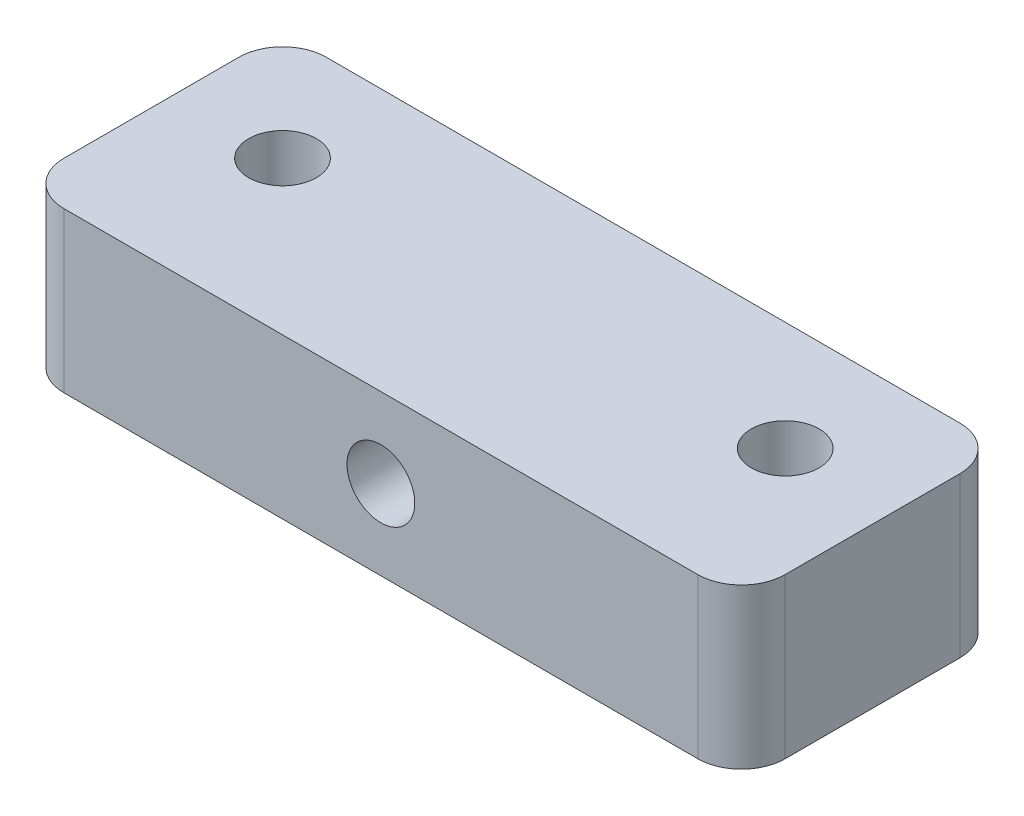
ISO-10303-21;
HEADER;
FILE_DESCRIPTION(('STEP AP214'),'2;1');
FILE_NAME('part.step','',(''),(''),'','','');
FILE_SCHEMA(('AUTOMOTIVE_DESIGN { 1 0 10303 214 1 1 1 1 }'));
ENDSEC;
DATA;
#1=APPLICATION_CONTEXT('core data for automotive mechanical design processes');
#2=APPLICATION_PROTOCOL_DEFINITION('international standard','automotive_design',2000,#1);
#3=PRODUCT_CONTEXT('',#1,'mechanical');
#4=PRODUCT('Part','Part','',(#3));
#5=PRODUCT_RELATED_PRODUCT_CATEGORY('part','',(#4));
#6=PRODUCT_DEFINITION_FORMATION('','',#4);
#7=PRODUCT_DEFINITION_CONTEXT('part definition',#1,'design');
#8=PRODUCT_DEFINITION('design','',#6,#7);
#9=PRODUCT_DEFINITION_SHAPE('','',#8);
#10=(LENGTH_UNIT() NAMED_UNIT(*) SI_UNIT(.MILLI.,.METRE.));
#11=(NAMED_UNIT(*) PLANE_ANGLE_UNIT() SI_UNIT($,.RADIAN.));
#12=(NAMED_UNIT(*) SI_UNIT($,.STERADIAN.) SOLID_ANGLE_UNIT());
#13=UNCERTAINTY_MEASURE_WITH_UNIT(LENGTH_MEASURE(1.E-05),#10,'distance_accuracy_value','');
#14=(GEOMETRIC_REPRESENTATION_CONTEXT(3) GLOBAL_UNCERTAINTY_ASSIGNED_CONTEXT((#13)) GLOBAL_UNIT_ASSIGNED_CONTEXT((#10,
#11,#12)) REPRESENTATION_CONTEXT('',''));
#15=CARTESIAN_POINT('',(0.,0.,0.));
#16=DIRECTION('',(0.,0.,1.));
#17=DIRECTION('',(1.,0.,0.));
#18=AXIS2_PLACEMENT_3D('',#15,#16,#17);
#19=CARTESIAN_POINT('',(0.,3.65,0.));
#20=DIRECTION('',(0.,1.,0.));
#21=DIRECTION('',(0.,0.,1.));
#22=AXIS2_PLACEMENT_3D('',#19,#20,#21);
#23=PLANE('',#22);
#24=CARTESIAN_POINT('',(-11.5,3.65,-7.));
#25=DIRECTION('',(0.,1.,0.));
#26=DIRECTION('',(0.,0.,1.));
#27=AXIS2_PLACEMENT_3D('',#24,#25,#26);
#28=CIRCLE('',#27,1.55);
#29=CARTESIAN_POINT('',(-11.5,3.65,-5.45));
#30=VERTEX_POINT('',#29);
#31=EDGE_CURVE('E125',#30,#30,#28,.T.);
#32=ORIENTED_EDGE('',*,*,#31,.F.);
#33=EDGE_LOOP('',(#32));
#34=FACE_BOUND('',#33,.T.);
#35=DIRECTION('',(-1.,0.,0.));
#36=VECTOR('',#35,1.);
#37=CARTESIAN_POINT('',(-16.5,3.65,-12.));
#38=LINE('',#37,#36);
#39=CARTESIAN_POINT('',(14.5,3.65,-12.));
#40=VERTEX_POINT('',#39);
#41=CARTESIAN_POINT('',(-14.5,3.65,-12.));
#42=VERTEX_POINT('',#41);
#43=EDGE_CURVE('E134',#40,#42,#38,.T.);
#44=ORIENTED_EDGE('',*,*,#43,.T.);
#45=CARTESIAN_POINT('',(-14.5,3.65,-10.));
#46=DIRECTION('',(0.,1.,0.));
#47=DIRECTION('',(0.,0.,1.));
#48=AXIS2_PLACEMENT_3D('',#45,#46,#47);
#49=CIRCLE('',#48,2.);
#50=CARTESIAN_POINT('',(-16.5,3.65,-10.));
#51=VERTEX_POINT('',#50);
#52=EDGE_CURVE('E161',#42,#51,#49,.T.);
#53=ORIENTED_EDGE('',*,*,#52,.T.);
#54=DIRECTION('',(0.,0.,1.));
#55=VECTOR('',#54,1.);
#56=CARTESIAN_POINT('',(-16.5,3.65,-12.));
#57=LINE('',#56,#55);
#58=CARTESIAN_POINT('',(-16.5,3.65,-2.));
#59=VERTEX_POINT('',#58);
#60=EDGE_CURVE('E118',#51,#59,#57,.T.);
#61=ORIENTED_EDGE('',*,*,#60,.T.);
#62=CARTESIAN_POINT('',(-14.5,3.65,-2.));
#63=DIRECTION('',(0.,1.,0.));
#64=DIRECTION('',(0.,0.,1.));
#65=AXIS2_PLACEMENT_3D('',#62,#63,#64);
#66=CIRCLE('',#65,2.);
#67=CARTESIAN_POINT('',(-14.5,3.65,0.));
#68=VERTEX_POINT('',#67);
#69=EDGE_CURVE('E156',#59,#68,#66,.T.);
#70=ORIENTED_EDGE('',*,*,#69,.T.);
#71=DIRECTION('',(1.,0.,0.));
#72=VECTOR('',#71,1.);
#73=CARTESIAN_POINT('',(-16.5,3.65,0.));
#74=LINE('',#73,#72);
#75=CARTESIAN_POINT('',(14.5,3.65,0.));
#76=VERTEX_POINT('',#75);
#77=EDGE_CURVE('E172',#68,#76,#74,.T.);
#78=ORIENTED_EDGE('',*,*,#77,.T.);
#79=CARTESIAN_POINT('',(14.5,3.65,-2.));
#80=DIRECTION('',(0.,1.,0.));
#81=DIRECTION('',(0.,0.,1.));
#82=AXIS2_PLACEMENT_3D('',#79,#80,#81);
#83=CIRCLE('',#82,2.);
#84=CARTESIAN_POINT('',(16.5,3.65,-2.));
#85=VERTEX_POINT('',#84);
#86=EDGE_CURVE('E54',#76,#85,#83,.T.);
#87=ORIENTED_EDGE('',*,*,#86,.T.);
#88=DIRECTION('',(0.,0.,-1.));
#89=VECTOR('',#88,1.);
#90=CARTESIAN_POINT('',(16.5,3.65,-12.));
#91=LINE('',#90,#89);
#92=CARTESIAN_POINT('',(16.5,3.65,-10.));
#93=VERTEX_POINT('',#92);
#94=EDGE_CURVE('E180',#85,#93,#91,.T.);
#95=ORIENTED_EDGE('',*,*,#94,.T.);
#96=CARTESIAN_POINT('',(14.5,3.65,-10.));
#97=DIRECTION('',(0.,1.,0.));
#98=DIRECTION('',(0.,0.,1.));
#99=AXIS2_PLACEMENT_3D('',#96,#97,#98);
#100=CIRCLE('',#99,2.);
#101=EDGE_CURVE('E159',#93,#40,#100,.T.);
#102=ORIENTED_EDGE('',*,*,#101,.T.);
#103=EDGE_LOOP('',(#44,#53,#61,#70,#78,#87,#95,#102));
#104=FACE_BOUND('',#103,.T.);
#105=CARTESIAN_POINT('',(11.5,3.65,-7.));
#106=DIRECTION('',(0.,1.,0.));
#107=DIRECTION('',(0.,0.,-1.));
#108=AXIS2_PLACEMENT_3D('',#105,#106,#107);
#109=CIRCLE('',#108,1.55);
#110=CARTESIAN_POINT('',(11.5,3.65,-8.55));
#111=VERTEX_POINT('',#110);
#112=EDGE_CURVE('E131',#111,#111,#109,.T.);
#113=ORIENTED_EDGE('',*,*,#112,.F.);
#114=EDGE_LOOP('',(#113));
#115=FACE_BOUND('',#114,.T.);
#116=ADVANCED_FACE('F32',(#34,#104,#115),#23,.T.);
#117=CARTESIAN_POINT('',(0.,-3.65,0.));
#118=DIRECTION('',(0.,1.,0.));
#119=DIRECTION('',(0.,0.,1.));
#120=AXIS2_PLACEMENT_3D('',#117,#118,#119);
#121=PLANE('',#120);
#122=CARTESIAN_POINT('',(-11.5,-3.65,-7.));
#123=DIRECTION('',(0.,1.,0.));
#124=DIRECTION('',(0.,0.,1.));
#125=AXIS2_PLACEMENT_3D('',#122,#123,#124);
#126=CIRCLE('',#125,1.9);
#127=CARTESIAN_POINT('',(-11.5,-3.65,-5.1));
#128=VERTEX_POINT('',#127);
#129=EDGE_CURVE('E144',#128,#128,#126,.T.);
#130=ORIENTED_EDGE('',*,*,#129,.T.);
#131=EDGE_LOOP('',(#130));
#132=FACE_BOUND('',#131,.T.);
#133=CARTESIAN_POINT('',(11.5,-3.65,-7.));
#134=DIRECTION('',(0.,1.,0.));
#135=DIRECTION('',(0.,0.,1.));
#136=AXIS2_PLACEMENT_3D('',#133,#134,#135);
#137=CIRCLE('',#136,1.9);
#138=CARTESIAN_POINT('',(11.5,-3.65,-5.1));
#139=VERTEX_POINT('',#138);
#140=EDGE_CURVE('E205',#139,#139,#137,.T.);
#141=ORIENTED_EDGE('',*,*,#140,.T.);
#142=EDGE_LOOP('',(#141));
#143=FACE_BOUND('',#142,.T.);
#144=DIRECTION('',(0.,0.,1.));
#145=VECTOR('',#144,1.);
#146=CARTESIAN_POINT('',(-16.5,-3.65,-12.));
#147=LINE('',#146,#145);
#148=CARTESIAN_POINT('',(-16.5,-3.65,-10.));
#149=VERTEX_POINT('',#148);
#150=CARTESIAN_POINT('',(-16.5,-3.65,-2.));
#151=VERTEX_POINT('',#150);
#152=EDGE_CURVE('E115',#149,#151,#147,.T.);
#153=ORIENTED_EDGE('',*,*,#152,.F.);
#154=CARTESIAN_POINT('',(-14.5,-3.65,-10.));
#155=DIRECTION('',(0.,1.,0.));
#156=DIRECTION('',(0.,0.,1.));
#157=AXIS2_PLACEMENT_3D('',#154,#155,#156);
#158=CIRCLE('',#157,2.);
#159=CARTESIAN_POINT('',(-14.5,-3.65,-12.));
#160=VERTEX_POINT('',#159);
#161=EDGE_CURVE('E98',#149,#160,#158,.F.);
#162=ORIENTED_EDGE('',*,*,#161,.T.);
#163=DIRECTION('',(-1.,0.,0.));
#164=VECTOR('',#163,1.);
#165=CARTESIAN_POINT('',(-16.5,-3.65,-12.));
#166=LINE('',#165,#164);
#167=CARTESIAN_POINT('',(14.5,-3.65,-12.));
#168=VERTEX_POINT('',#167);
#169=EDGE_CURVE('E138',#168,#160,#166,.T.);
#170=ORIENTED_EDGE('',*,*,#169,.F.);
#171=CARTESIAN_POINT('',(14.5,-3.65,-10.));
#172=DIRECTION('',(0.,1.,0.));
#173=DIRECTION('',(0.,0.,1.));
#174=AXIS2_PLACEMENT_3D('',#171,#172,#173);
#175=CIRCLE('',#174,2.);
#176=CARTESIAN_POINT('',(16.5,-3.65,-10.));
#177=VERTEX_POINT('',#176);
#178=EDGE_CURVE('E109',#168,#177,#175,.F.);
#179=ORIENTED_EDGE('',*,*,#178,.T.);
#180=DIRECTION('',(0.,0.,-1.));
#181=VECTOR('',#180,1.);
#182=CARTESIAN_POINT('',(16.5,-3.65,-12.));
#183=LINE('',#182,#181);
#184=CARTESIAN_POINT('',(16.5,-3.65,-2.));
#185=VERTEX_POINT('',#184);
#186=EDGE_CURVE('E128',#185,#177,#183,.T.);
#187=ORIENTED_EDGE('',*,*,#186,.F.);
#188=CARTESIAN_POINT('',(14.5,-3.65,-2.));
#189=DIRECTION('',(0.,1.,0.));
#190=DIRECTION('',(0.,0.,1.));
#191=AXIS2_PLACEMENT_3D('',#188,#189,#190);
#192=CIRCLE('',#191,2.);
#193=CARTESIAN_POINT('',(14.5,-3.65,0.));
#194=VERTEX_POINT('',#193);
#195=EDGE_CURVE('E150',#185,#194,#192,.F.);
#196=ORIENTED_EDGE('',*,*,#195,.T.);
#197=DIRECTION('',(1.,0.,0.));
#198=VECTOR('',#197,1.);
#199=CARTESIAN_POINT('',(-16.5,-3.65,0.));
#200=LINE('',#199,#198);
#201=CARTESIAN_POINT('',(-14.5,-3.65,0.));
#202=VERTEX_POINT('',#201);
#203=EDGE_CURVE('E124',#202,#194,#200,.T.);
#204=ORIENTED_EDGE('',*,*,#203,.F.);
#205=CARTESIAN_POINT('',(-14.5,-3.65,-2.));
#206=DIRECTION('',(0.,1.,0.));
#207=DIRECTION('',(0.,0.,1.));
#208=AXIS2_PLACEMENT_3D('',#205,#206,#207);
#209=CIRCLE('',#208,2.);
#210=EDGE_CURVE('E119',#202,#151,#209,.F.);
#211=ORIENTED_EDGE('',*,*,#210,.T.);
#212=EDGE_LOOP('',(#153,#162,#170,#179,#187,#196,#204,#211));
#213=FACE_BOUND('',#212,.T.);
#214=ADVANCED_FACE('F122',(#132,#143,#213),#121,.F.);
#215=CARTESIAN_POINT('',(-16.5,3.65,-12.));
#216=DIRECTION('',(1.,0.,0.));
#217=DIRECTION('',(0.,0.,-1.));
#218=AXIS2_PLACEMENT_3D('',#215,#216,#217);
#219=PLANE('',#218);
#220=ORIENTED_EDGE('',*,*,#60,.F.);
#221=DIRECTION('',(0.,-1.,0.));
#222=VECTOR('',#221,1.);
#223=CARTESIAN_POINT('',(-16.5,3.65,-10.));
#224=LINE('',#223,#222);
#225=EDGE_CURVE('E102',#51,#149,#224,.T.);
#226=ORIENTED_EDGE('',*,*,#225,.T.);
#227=ORIENTED_EDGE('',*,*,#152,.T.);
#228=DIRECTION('',(0.,-1.,0.));
#229=VECTOR('',#228,1.);
#230=CARTESIAN_POINT('',(-16.5,3.65,-2.));
#231=LINE('',#230,#229);
#232=EDGE_CURVE('E120',#151,#59,#231,.F.);
#233=ORIENTED_EDGE('',*,*,#232,.T.);
#234=EDGE_LOOP('',(#220,#226,#227,#233));
#235=FACE_BOUND('',#234,.T.);
#236=ADVANCED_FACE('F114',(#235),#219,.F.);
#237=CARTESIAN_POINT('',(-16.5,3.65,0.));
#238=DIRECTION('',(0.,0.,-1.));
#239=DIRECTION('',(-1.,0.,0.));
#240=AXIS2_PLACEMENT_3D('',#237,#238,#239);
#241=PLANE('',#240);
#242=CARTESIAN_POINT('',(0.,0.,0.));
#243=DIRECTION('',(0.,0.,1.));
#244=DIRECTION('',(1.,0.,0.));
#245=AXIS2_PLACEMENT_3D('',#242,#243,#244);
#246=CIRCLE('',#245,1.55);
#247=CARTESIAN_POINT('',(1.55,0.,0.));
#248=VERTEX_POINT('',#247);
#249=EDGE_CURVE('E147',#248,#248,#246,.T.);
#250=ORIENTED_EDGE('',*,*,#249,.F.);
#251=EDGE_LOOP('',(#250));
#252=FACE_BOUND('',#251,.T.);
#253=ORIENTED_EDGE('',*,*,#203,.T.);
#254=DIRECTION('',(0.,-1.,0.));
#255=VECTOR('',#254,1.);
#256=CARTESIAN_POINT('',(14.5,3.65,0.));
#257=LINE('',#256,#255);
#258=EDGE_CURVE('E11',#194,#76,#257,.F.);
#259=ORIENTED_EDGE('',*,*,#258,.T.);
#260=ORIENTED_EDGE('',*,*,#77,.F.);
#261=DIRECTION('',(0.,-1.,0.));
#262=VECTOR('',#261,1.);
#263=CARTESIAN_POINT('',(-14.5,3.65,0.));
#264=LINE('',#263,#262);
#265=EDGE_CURVE('E40',#68,#202,#264,.T.);
#266=ORIENTED_EDGE('',*,*,#265,.T.);
#267=EDGE_LOOP('',(#253,#259,#260,#266));
#268=FACE_BOUND('',#267,.T.);
#269=ADVANCED_FACE('F170',(#252,#268),#241,.F.);
#270=CARTESIAN_POINT('',(16.5,3.65,-12.));
#271=DIRECTION('',(-1.,0.,0.));
#272=DIRECTION('',(0.,0.,1.));
#273=AXIS2_PLACEMENT_3D('',#270,#271,#272);
#274=PLANE('',#273);
#275=ORIENTED_EDGE('',*,*,#186,.T.);
#276=DIRECTION('',(0.,-1.,0.));
#277=VECTOR('',#276,1.);
#278=CARTESIAN_POINT('',(16.5,3.65,-10.));
#279=LINE('',#278,#277);
#280=EDGE_CURVE('E47',#177,#93,#279,.F.);
#281=ORIENTED_EDGE('',*,*,#280,.T.);
#282=ORIENTED_EDGE('',*,*,#94,.F.);
#283=DIRECTION('',(0.,-1.,0.));
#284=VECTOR('',#283,1.);
#285=CARTESIAN_POINT('',(16.5,3.65,-2.));
#286=LINE('',#285,#284);
#287=EDGE_CURVE('E163',#85,#185,#286,.T.);
#288=ORIENTED_EDGE('',*,*,#287,.T.);
#289=EDGE_LOOP('',(#275,#281,#282,#288));
#290=FACE_BOUND('',#289,.T.);
#291=ADVANCED_FACE('F179',(#290),#274,.F.);
#292=CARTESIAN_POINT('',(-16.5,3.65,-12.));
#293=DIRECTION('',(0.,0.,1.));
#294=DIRECTION('',(1.,0.,0.));
#295=AXIS2_PLACEMENT_3D('',#292,#293,#294);
#296=PLANE('',#295);
#297=CARTESIAN_POINT('',(0.,0.,-12.));
#298=DIRECTION('',(0.,0.,1.));
#299=DIRECTION('',(1.,0.,0.));
#300=AXIS2_PLACEMENT_3D('',#297,#298,#299);
#301=CIRCLE('',#300,2.33744331762962);
#302=CARTESIAN_POINT('',(2.33744331762962,0.,-12.));
#303=VERTEX_POINT('',#302);
#304=EDGE_CURVE('E188',#303,#303,#301,.T.);
#305=ORIENTED_EDGE('',*,*,#304,.T.);
#306=EDGE_LOOP('',(#305));
#307=FACE_BOUND('',#306,.T.);
#308=ORIENTED_EDGE('',*,*,#169,.T.);
#309=DIRECTION('',(0.,-1.,0.));
#310=VECTOR('',#309,1.);
#311=CARTESIAN_POINT('',(-14.5,3.65,-12.));
#312=LINE('',#311,#310);
#313=EDGE_CURVE('E103',#160,#42,#312,.F.);
#314=ORIENTED_EDGE('',*,*,#313,.T.);
#315=ORIENTED_EDGE('',*,*,#43,.F.);
#316=DIRECTION('',(0.,-1.,0.));
#317=VECTOR('',#316,1.);
#318=CARTESIAN_POINT('',(14.5,3.65,-12.));
#319=LINE('',#318,#317);
#320=EDGE_CURVE('E108',#40,#168,#319,.T.);
#321=ORIENTED_EDGE('',*,*,#320,.T.);
#322=EDGE_LOOP('',(#308,#314,#315,#321));
#323=FACE_BOUND('',#322,.T.);
#324=ADVANCED_FACE('F244',(#307,#323),#296,.F.);
#325=CARTESIAN_POINT('',(-11.5,3.65,-7.));
#326=DIRECTION('',(0.,-1.,0.));
#327=DIRECTION('',(0.,0.,-1.));
#328=AXIS2_PLACEMENT_3D('',#325,#326,#327);
#329=CYLINDRICAL_SURFACE('',#328,1.55);
#330=CARTESIAN_POINT('',(-11.5,0.65,-7.));
#331=DIRECTION('',(0.,1.,0.));
#332=DIRECTION('',(0.,0.,1.));
#333=AXIS2_PLACEMENT_3D('',#330,#331,#332);
#334=CIRCLE('',#333,1.55);
#335=CARTESIAN_POINT('',(-11.5,0.65,-5.45));
#336=VERTEX_POINT('',#335);
#337=EDGE_CURVE('E143',#336,#336,#334,.T.);
#338=ORIENTED_EDGE('',*,*,#337,.F.);
#339=EDGE_LOOP('',(#338));
#340=FACE_BOUND('',#339,.T.);
#341=ORIENTED_EDGE('',*,*,#31,.T.);
#342=EDGE_LOOP('',(#341));
#343=FACE_BOUND('',#342,.T.);
#344=ADVANCED_FACE('F241',(#340,#343),#329,.F.);
#345=CARTESIAN_POINT('',(11.5,3.65,-7.));
#346=DIRECTION('',(0.,-1.,0.));
#347=DIRECTION('',(0.,0.,-1.));
#348=AXIS2_PLACEMENT_3D('',#345,#346,#347);
#349=CYLINDRICAL_SURFACE('',#348,1.55);
#350=CARTESIAN_POINT('',(11.5,0.65,-7.));
#351=DIRECTION('',(0.,1.,0.));
#352=DIRECTION('',(0.,0.,1.));
#353=AXIS2_PLACEMENT_3D('',#350,#351,#352);
#354=CIRCLE('',#353,1.55);
#355=CARTESIAN_POINT('',(11.5,0.65,-5.45));
#356=VERTEX_POINT('',#355);
#357=EDGE_CURVE('E140',#356,#356,#354,.T.);
#358=ORIENTED_EDGE('',*,*,#357,.F.);
#359=EDGE_LOOP('',(#358));
#360=FACE_BOUND('',#359,.T.);
#361=ORIENTED_EDGE('',*,*,#112,.T.);
#362=EDGE_LOOP('',(#361));
#363=FACE_BOUND('',#362,.T.);
#364=ADVANCED_FACE('F269',(#360,#363),#349,.F.);
#365=CARTESIAN_POINT('',(0.,0.,-12.));
#366=DIRECTION('',(0.,0.,-1.));
#367=DIRECTION('',(-1.,0.,0.));
#368=AXIS2_PLACEMENT_3D('',#365,#366,#367);
#369=CONICAL_SURFACE('',#368,2.33744331762962,0.0872664625997169);
#370=CARTESIAN_POINT('',(0.,0.,-7.));
#371=DIRECTION('',(0.,0.,1.));
#372=DIRECTION('',(1.,0.,0.));
#373=AXIS2_PLACEMENT_3D('',#370,#371,#372);
#374=CIRCLE('',#373,1.9);
#375=CARTESIAN_POINT('',(1.9,0.,-7.));
#376=VERTEX_POINT('',#375);
#377=EDGE_CURVE('E191',#376,#376,#374,.T.);
#378=ORIENTED_EDGE('',*,*,#377,.T.);
#379=EDGE_LOOP('',(#378));
#380=FACE_BOUND('',#379,.T.);
#381=ORIENTED_EDGE('',*,*,#304,.F.);
#382=EDGE_LOOP('',(#381));
#383=FACE_BOUND('',#382,.T.);
#384=ADVANCED_FACE('F271',(#380,#383),#369,.F.);
#385=CARTESIAN_POINT('',(0.,0.,12.));
#386=DIRECTION('',(0.,0.,1.));
#387=DIRECTION('',(1.,0.,0.));
#388=AXIS2_PLACEMENT_3D('',#385,#386,#387);
#389=CYLINDRICAL_SURFACE('',#388,1.9);
#390=CARTESIAN_POINT('',(0.,0.,-3.));
#391=DIRECTION('',(0.,0.,1.));
#392=DIRECTION('',(1.,0.,0.));
#393=AXIS2_PLACEMENT_3D('',#390,#391,#392);
#394=CIRCLE('',#393,1.9);
#395=CARTESIAN_POINT('',(1.9,0.,-3.));
#396=VERTEX_POINT('',#395);
#397=EDGE_CURVE('E194',#396,#396,#394,.T.);
#398=ORIENTED_EDGE('',*,*,#397,.T.);
#399=EDGE_LOOP('',(#398));
#400=FACE_BOUND('',#399,.T.);
#401=ORIENTED_EDGE('',*,*,#377,.F.);
#402=EDGE_LOOP('',(#401));
#403=FACE_BOUND('',#402,.T.);
#404=ADVANCED_FACE('F277',(#400,#403),#389,.F.);
#405=CARTESIAN_POINT('',(0.,1.9,-3.));
#406=DIRECTION('',(0.,0.,-1.));
#407=DIRECTION('',(-1.,0.,0.));
#408=AXIS2_PLACEMENT_3D('',#405,#406,#407);
#409=PLANE('',#408);
#410=CARTESIAN_POINT('',(0.,0.,-3.));
#411=DIRECTION('',(0.,0.,1.));
#412=DIRECTION('',(1.,0.,0.));
#413=AXIS2_PLACEMENT_3D('',#410,#411,#412);
#414=CIRCLE('',#413,1.55);
#415=CARTESIAN_POINT('',(1.55,0.,-3.));
#416=VERTEX_POINT('',#415);
#417=EDGE_CURVE('E197',#416,#416,#414,.T.);
#418=ORIENTED_EDGE('',*,*,#417,.T.);
#419=EDGE_LOOP('',(#418));
#420=FACE_BOUND('',#419,.T.);
#421=ORIENTED_EDGE('',*,*,#397,.F.);
#422=EDGE_LOOP('',(#421));
#423=FACE_BOUND('',#422,.T.);
#424=ADVANCED_FACE('F285',(#420,#423),#409,.T.);
#425=CARTESIAN_POINT('',(0.,0.,12.));
#426=DIRECTION('',(0.,0.,1.));
#427=DIRECTION('',(1.,0.,0.));
#428=AXIS2_PLACEMENT_3D('',#425,#426,#427);
#429=CYLINDRICAL_SURFACE('',#428,1.55);
#430=ORIENTED_EDGE('',*,*,#249,.T.);
#431=EDGE_LOOP('',(#430));
#432=FACE_BOUND('',#431,.T.);
#433=ORIENTED_EDGE('',*,*,#417,.F.);
#434=EDGE_LOOP('',(#433));
#435=FACE_BOUND('',#434,.T.);
#436=ADVANCED_FACE('F289',(#432,#435),#429,.F.);
#437=CARTESIAN_POINT('',(11.5,-3.65,-7.));
#438=DIRECTION('',(0.,1.,0.));
#439=DIRECTION('',(0.,0.,1.));
#440=AXIS2_PLACEMENT_3D('',#437,#438,#439);
#441=CYLINDRICAL_SURFACE('',#440,1.9);
#442=CARTESIAN_POINT('',(11.5,0.65,-7.));
#443=DIRECTION('',(0.,1.,0.));
#444=DIRECTION('',(0.,0.,1.));
#445=AXIS2_PLACEMENT_3D('',#442,#443,#444);
#446=CIRCLE('',#445,1.9);
#447=CARTESIAN_POINT('',(11.5,0.649999999999999,-5.1));
#448=VERTEX_POINT('',#447);
#449=EDGE_CURVE('E202',#448,#448,#446,.T.);
#450=CARTESIAN_POINT('',(11.5,-3.65,-5.1));
#451=CARTESIAN_POINT('',(11.5,-3.60520833333333,-5.1));
#452=CARTESIAN_POINT('',(11.5,-3.56041666666667,-5.1));
#453=CARTESIAN_POINT('',(11.5,-3.47083333333333,-5.1));
#454=CARTESIAN_POINT('',(11.5,-3.42604166666667,-5.1));
#455=CARTESIAN_POINT('',(11.5,-3.33645833333333,-5.1));
#456=CARTESIAN_POINT('',(11.5,-3.29166666666667,-5.1));
#457=CARTESIAN_POINT('',(11.5,-3.20208333333333,-5.1));
#458=CARTESIAN_POINT('',(11.5,-3.15729166666667,-5.1));
#459=CARTESIAN_POINT('',(11.5,-3.06770833333333,-5.1));
#460=CARTESIAN_POINT('',(11.5,-3.02291666666667,-5.1));
#461=CARTESIAN_POINT('',(11.5,-2.93333333333333,-5.1));
#462=CARTESIAN_POINT('',(11.5,-2.88854166666667,-5.1));
#463=CARTESIAN_POINT('',(11.5,-2.79895833333333,-5.1));
#464=CARTESIAN_POINT('',(11.5,-2.75416666666667,-5.1));
#465=CARTESIAN_POINT('',(11.5,-2.66458333333333,-5.1));
#466=CARTESIAN_POINT('',(11.5,-2.61979166666667,-5.1));
#467=CARTESIAN_POINT('',(11.5,-2.53020833333333,-5.1));
#468=CARTESIAN_POINT('',(11.5,-2.48541666666667,-5.1));
#469=CARTESIAN_POINT('',(11.5,-2.39583333333333,-5.1));
#470=CARTESIAN_POINT('',(11.5,-2.35104166666667,-5.1));
#471=CARTESIAN_POINT('',(11.5,-2.26145833333333,-5.1));
#472=CARTESIAN_POINT('',(11.5,-2.21666666666667,-5.1));
#473=CARTESIAN_POINT('',(11.5,-2.12708333333333,-5.1));
#474=CARTESIAN_POINT('',(11.5,-2.08229166666667,-5.1));
#475=CARTESIAN_POINT('',(11.5,-1.99270833333333,-5.1));
#476=CARTESIAN_POINT('',(11.5,-1.94791666666667,-5.1));
#477=CARTESIAN_POINT('',(11.5,-1.85833333333333,-5.1));
#478=CARTESIAN_POINT('',(11.5,-1.81354166666667,-5.1));
#479=CARTESIAN_POINT('',(11.5,-1.72395833333333,-5.1));
#480=CARTESIAN_POINT('',(11.5,-1.67916666666667,-5.1));
#481=CARTESIAN_POINT('',(11.5,-1.58958333333333,-5.1));
#482=CARTESIAN_POINT('',(11.5,-1.54479166666667,-5.1));
#483=CARTESIAN_POINT('',(11.5,-1.45520833333333,-5.1));
#484=CARTESIAN_POINT('',(11.5,-1.41041666666667,-5.1));
#485=CARTESIAN_POINT('',(11.5,-1.32083333333333,-5.1));
#486=CARTESIAN_POINT('',(11.5,-1.27604166666667,-5.1));
#487=CARTESIAN_POINT('',(11.5,-1.18645833333333,-5.1));
#488=CARTESIAN_POINT('',(11.5,-1.14166666666667,-5.1));
#489=CARTESIAN_POINT('',(11.5,-1.05208333333333,-5.1));
#490=CARTESIAN_POINT('',(11.5,-1.00729166666667,-5.1));
#491=CARTESIAN_POINT('',(11.5,-0.917708333333334,-5.1));
#492=CARTESIAN_POINT('',(11.5,-0.872916666666668,-5.1));
#493=CARTESIAN_POINT('',(11.5,-0.783333333333334,-5.1));
#494=CARTESIAN_POINT('',(11.5,-0.738541666666667,-5.1));
#495=CARTESIAN_POINT('',(11.5,-0.648958333333334,-5.1));
#496=CARTESIAN_POINT('',(11.5,-0.604166666666667,-5.1));
#497=CARTESIAN_POINT('',(11.5,-0.514583333333334,-5.1));
#498=CARTESIAN_POINT('',(11.5,-0.469791666666667,-5.1));
#499=CARTESIAN_POINT('',(11.5,-0.380208333333334,-5.1));
#500=CARTESIAN_POINT('',(11.5,-0.335416666666668,-5.1));
#501=CARTESIAN_POINT('',(11.5,-0.245833333333334,-5.1));
#502=CARTESIAN_POINT('',(11.5,-0.201041666666668,-5.1));
#503=CARTESIAN_POINT('',(11.5,-0.111458333333334,-5.1));
#504=CARTESIAN_POINT('',(11.5,-0.0666666666666677,-5.1));
#505=CARTESIAN_POINT('',(11.5,0.0229166666666657,-5.1));
#506=CARTESIAN_POINT('',(11.5,0.0677083333333325,-5.1));
#507=CARTESIAN_POINT('',(11.5,0.157291666666666,-5.1));
#508=CARTESIAN_POINT('',(11.5,0.202083333333333,-5.1));
#509=CARTESIAN_POINT('',(11.5,0.291666666666666,-5.1));
#510=CARTESIAN_POINT('',(11.5,0.336458333333333,-5.1));
#511=CARTESIAN_POINT('',(11.5,0.426041666666666,-5.1));
#512=CARTESIAN_POINT('',(11.5,0.470833333333333,-5.1));
#513=CARTESIAN_POINT('',(11.5,0.560416666666666,-5.1));
#514=CARTESIAN_POINT('',(11.5,0.605208333333332,-5.1));
#515=CARTESIAN_POINT('',(11.5,0.649999999999999,-5.1));
#516=B_SPLINE_CURVE_WITH_KNOTS('',3,(#450,#451,#452,#453,#454,#455,#456,#457,#458,#459,#460,
#461,#462,#463,#464,#465,#466,#467,#468,#469,#470,#471,#472,#473,#474,#475,#476,#477,#478,#479,
#480,#481,#482,#483,#484,#485,#486,#487,#488,#489,#490,#491,#492,#493,#494,#495,#496,#497,#498,
#499,#500,#501,#502,#503,#504,#505,#506,#507,#508,#509,#510,#511,#512,#513,#514,#515),
.UNSPECIFIED.,.F.,.F.,(4,2,2,2,2,2,2,2,2,2,2,2,2,2,2,2,2,2,2,2,2,2,2,2,2,2,2,2,2,2,2,2,4),(0.,
0.134375,0.26875,0.403125,0.5375,0.671875,0.80625,0.940625,1.075,1.209375,1.34375,1.478125,
1.6125,1.746875,1.88125,2.015625,2.15,2.284375,2.41875,2.553125,2.6875,2.821875,2.95625,
3.090625,3.225,3.359375,3.49375,3.628125,3.7625,3.896875,4.03125,4.165625,4.3),.UNSPECIFIED.);
#517=EDGE_CURVE('BSEAM293',#139,#448,#516,.T.);
#518=ORIENTED_EDGE('',*,*,#140,.F.);
#519=ORIENTED_EDGE('',*,*,#449,.T.);
#520=ORIENTED_EDGE('',*,*,#517,.T.);
#521=ORIENTED_EDGE('',*,*,#517,.F.);
#522=EDGE_LOOP('',(#518,#520,#519,#521));
#523=FACE_BOUND('',#522,.T.);
#524=ADVANCED_FACE('F293',(#523),#441,.F.);
#525=CARTESIAN_POINT('',(11.5,0.65,-7.));
#526=DIRECTION('',(0.,1.,0.));
#527=DIRECTION('',(0.,0.,1.));
#528=AXIS2_PLACEMENT_3D('',#525,#526,#527);
#529=PLANE('',#528);
#530=ORIENTED_EDGE('',*,*,#357,.T.);
#531=EDGE_LOOP('',(#530));
#532=FACE_BOUND('',#531,.T.);
#533=ORIENTED_EDGE('',*,*,#449,.F.);
#534=EDGE_LOOP('',(#533));
#535=FACE_BOUND('',#534,.T.);
#536=ADVANCED_FACE('F220',(#532,#535),#529,.F.);
#537=CARTESIAN_POINT('',(-11.5,-3.65,-7.));
#538=DIRECTION('',(0.,1.,0.));
#539=DIRECTION('',(0.,0.,1.));
#540=AXIS2_PLACEMENT_3D('',#537,#538,#539);
#541=CYLINDRICAL_SURFACE('',#540,1.9);
#542=CARTESIAN_POINT('',(-11.5,0.65,-7.));
#543=DIRECTION('',(0.,1.,0.));
#544=DIRECTION('',(0.,0.,1.));
#545=AXIS2_PLACEMENT_3D('',#542,#543,#544);
#546=CIRCLE('',#545,1.9);
#547=CARTESIAN_POINT('',(-11.5,0.649999999999999,-5.1));
#548=VERTEX_POINT('',#547);
#549=EDGE_CURVE('E208',#548,#548,#546,.T.);
#550=CARTESIAN_POINT('',(-11.5,-3.65,-5.1));
#551=CARTESIAN_POINT('',(-11.5,-3.60520833333333,-5.1));
#552=CARTESIAN_POINT('',(-11.5,-3.56041666666667,-5.1));
#553=CARTESIAN_POINT('',(-11.5,-3.47083333333333,-5.1));
#554=CARTESIAN_POINT('',(-11.5,-3.42604166666667,-5.1));
#555=CARTESIAN_POINT('',(-11.5,-3.33645833333333,-5.1));
#556=CARTESIAN_POINT('',(-11.5,-3.29166666666667,-5.1));
#557=CARTESIAN_POINT('',(-11.5,-3.20208333333333,-5.1));
#558=CARTESIAN_POINT('',(-11.5,-3.15729166666667,-5.1));
#559=CARTESIAN_POINT('',(-11.5,-3.06770833333333,-5.1));
#560=CARTESIAN_POINT('',(-11.5,-3.02291666666667,-5.1));
#561=CARTESIAN_POINT('',(-11.5,-2.93333333333333,-5.1));
#562=CARTESIAN_POINT('',(-11.5,-2.88854166666667,-5.1));
#563=CARTESIAN_POINT('',(-11.5,-2.79895833333333,-5.1));
#564=CARTESIAN_POINT('',(-11.5,-2.75416666666667,-5.1));
#565=CARTESIAN_POINT('',(-11.5,-2.66458333333333,-5.1));
#566=CARTESIAN_POINT('',(-11.5,-2.61979166666667,-5.1));
#567=CARTESIAN_POINT('',(-11.5,-2.53020833333333,-5.1));
#568=CARTESIAN_POINT('',(-11.5,-2.48541666666667,-5.1));
#569=CARTESIAN_POINT('',(-11.5,-2.39583333333333,-5.1));
#570=CARTESIAN_POINT('',(-11.5,-2.35104166666667,-5.1));
#571=CARTESIAN_POINT('',(-11.5,-2.26145833333333,-5.1));
#572=CARTESIAN_POINT('',(-11.5,-2.21666666666667,-5.1));
#573=CARTESIAN_POINT('',(-11.5,-2.12708333333333,-5.1));
#574=CARTESIAN_POINT('',(-11.5,-2.08229166666667,-5.1));
#575=CARTESIAN_POINT('',(-11.5,-1.99270833333333,-5.1));
#576=CARTESIAN_POINT('',(-11.5,-1.94791666666667,-5.1));
#577=CARTESIAN_POINT('',(-11.5,-1.85833333333333,-5.1));
#578=CARTESIAN_POINT('',(-11.5,-1.81354166666667,-5.1));
#579=CARTESIAN_POINT('',(-11.5,-1.72395833333333,-5.1));
#580=CARTESIAN_POINT('',(-11.5,-1.67916666666667,-5.1));
#581=CARTESIAN_POINT('',(-11.5,-1.58958333333333,-5.1));
#582=CARTESIAN_POINT('',(-11.5,-1.54479166666667,-5.1));
#583=CARTESIAN_POINT('',(-11.5,-1.45520833333333,-5.1));
#584=CARTESIAN_POINT('',(-11.5,-1.41041666666667,-5.1));
#585=CARTESIAN_POINT('',(-11.5,-1.32083333333333,-5.1));
#586=CARTESIAN_POINT('',(-11.5,-1.27604166666667,-5.1));
#587=CARTESIAN_POINT('',(-11.5,-1.18645833333333,-5.1));
#588=CARTESIAN_POINT('',(-11.5,-1.14166666666667,-5.1));
#589=CARTESIAN_POINT('',(-11.5,-1.05208333333333,-5.1));
#590=CARTESIAN_POINT('',(-11.5,-1.00729166666667,-5.1));
#591=CARTESIAN_POINT('',(-11.5,-0.917708333333334,-5.1));
#592=CARTESIAN_POINT('',(-11.5,-0.872916666666668,-5.1));
#593=CARTESIAN_POINT('',(-11.5,-0.783333333333334,-5.1));
#594=CARTESIAN_POINT('',(-11.5,-0.738541666666667,-5.1));
#595=CARTESIAN_POINT('',(-11.5,-0.648958333333334,-5.1));
#596=CARTESIAN_POINT('',(-11.5,-0.604166666666667,-5.1));
#597=CARTESIAN_POINT('',(-11.5,-0.514583333333334,-5.1));
#598=CARTESIAN_POINT('',(-11.5,-0.469791666666667,-5.1));
#599=CARTESIAN_POINT('',(-11.5,-0.380208333333334,-5.1));
#600=CARTESIAN_POINT('',(-11.5,-0.335416666666668,-5.1));
#601=CARTESIAN_POINT('',(-11.5,-0.245833333333334,-5.1));
#602=CARTESIAN_POINT('',(-11.5,-0.201041666666668,-5.1));
#603=CARTESIAN_POINT('',(-11.5,-0.111458333333334,-5.1));
#604=CARTESIAN_POINT('',(-11.5,-0.0666666666666677,-5.1));
#605=CARTESIAN_POINT('',(-11.5,0.0229166666666657,-5.1));
#606=CARTESIAN_POINT('',(-11.5,0.0677083333333325,-5.1));
#607=CARTESIAN_POINT('',(-11.5,0.157291666666666,-5.1));
#608=CARTESIAN_POINT('',(-11.5,0.202083333333333,-5.1));
#609=CARTESIAN_POINT('',(-11.5,0.291666666666666,-5.1));
#610=CARTESIAN_POINT('',(-11.5,0.336458333333333,-5.1));
#611=CARTESIAN_POINT('',(-11.5,0.426041666666666,-5.1));
#612=CARTESIAN_POINT('',(-11.5,0.470833333333333,-5.1));
#613=CARTESIAN_POINT('',(-11.5,0.560416666666666,-5.1));
#614=CARTESIAN_POINT('',(-11.5,0.605208333333332,-5.1));
#615=CARTESIAN_POINT('',(-11.5,0.649999999999999,-5.1));
#616=B_SPLINE_CURVE_WITH_KNOTS('',3,(#550,#551,#552,#553,#554,#555,#556,#557,#558,#559,#560,
#561,#562,#563,#564,#565,#566,#567,#568,#569,#570,#571,#572,#573,#574,#575,#576,#577,#578,#579,
#580,#581,#582,#583,#584,#585,#586,#587,#588,#589,#590,#591,#592,#593,#594,#595,#596,#597,#598,
#599,#600,#601,#602,#603,#604,#605,#606,#607,#608,#609,#610,#611,#612,#613,#614,#615),
.UNSPECIFIED.,.F.,.F.,(4,2,2,2,2,2,2,2,2,2,2,2,2,2,2,2,2,2,2,2,2,2,2,2,2,2,2,2,2,2,2,2,4),(0.,
0.134375,0.26875,0.403125,0.5375,0.671875,0.80625,0.940625,1.075,1.209375,1.34375,1.478125,
1.6125,1.746875,1.88125,2.015625,2.15,2.284375,2.41875,2.553125,2.6875,2.821875,2.95625,
3.090625,3.225,3.359375,3.49375,3.628125,3.7625,3.896875,4.03125,4.165625,4.3),.UNSPECIFIED.);
#617=EDGE_CURVE('BSEAM216',#128,#548,#616,.T.);
#618=ORIENTED_EDGE('',*,*,#129,.F.);
#619=ORIENTED_EDGE('',*,*,#549,.T.);
#620=ORIENTED_EDGE('',*,*,#617,.T.);
#621=ORIENTED_EDGE('',*,*,#617,.F.);
#622=EDGE_LOOP('',(#618,#620,#619,#621));
#623=FACE_BOUND('',#622,.T.);
#624=ADVANCED_FACE('F216',(#623),#541,.F.);
#625=CARTESIAN_POINT('',(-11.5,0.65,-7.));
#626=DIRECTION('',(0.,1.,0.));
#627=DIRECTION('',(0.,0.,1.));
#628=AXIS2_PLACEMENT_3D('',#625,#626,#627);
#629=PLANE('',#628);
#630=ORIENTED_EDGE('',*,*,#337,.T.);
#631=EDGE_LOOP('',(#630));
#632=FACE_BOUND('',#631,.T.);
#633=ORIENTED_EDGE('',*,*,#549,.F.);
#634=EDGE_LOOP('',(#633));
#635=FACE_BOUND('',#634,.T.);
#636=ADVANCED_FACE('F219',(#632,#635),#629,.F.);
#637=CARTESIAN_POINT('',(-14.5,3.65,-10.));
#638=DIRECTION('',(0.,-1.,0.));
#639=DIRECTION('',(0.,0.,-1.));
#640=AXIS2_PLACEMENT_3D('',#637,#638,#639);
#641=CYLINDRICAL_SURFACE('',#640,2.);
#642=ORIENTED_EDGE('',*,*,#52,.F.);
#643=ORIENTED_EDGE('',*,*,#313,.F.);
#644=ORIENTED_EDGE('',*,*,#161,.F.);
#645=ORIENTED_EDGE('',*,*,#225,.F.);
#646=EDGE_LOOP('',(#642,#643,#644,#645));
#647=FACE_BOUND('',#646,.T.);
#648=ADVANCED_FACE('F101',(#647),#641,.T.);
#649=CARTESIAN_POINT('',(14.5,3.65,-10.));
#650=DIRECTION('',(0.,-1.,0.));
#651=DIRECTION('',(0.,0.,-1.));
#652=AXIS2_PLACEMENT_3D('',#649,#650,#651);
#653=CYLINDRICAL_SURFACE('',#652,2.);
#654=ORIENTED_EDGE('',*,*,#101,.F.);
#655=ORIENTED_EDGE('',*,*,#280,.F.);
#656=ORIENTED_EDGE('',*,*,#178,.F.);
#657=ORIENTED_EDGE('',*,*,#320,.F.);
#658=EDGE_LOOP('',(#654,#655,#656,#657));
#659=FACE_BOUND('',#658,.T.);
#660=ADVANCED_FACE('F230',(#659),#653,.T.);
#661=CARTESIAN_POINT('',(14.5,3.65,-2.));
#662=DIRECTION('',(0.,-1.,0.));
#663=DIRECTION('',(0.,0.,-1.));
#664=AXIS2_PLACEMENT_3D('',#661,#662,#663);
#665=CYLINDRICAL_SURFACE('',#664,2.);
#666=ORIENTED_EDGE('',*,*,#86,.F.);
#667=ORIENTED_EDGE('',*,*,#258,.F.);
#668=ORIENTED_EDGE('',*,*,#195,.F.);
#669=ORIENTED_EDGE('',*,*,#287,.F.);
#670=EDGE_LOOP('',(#666,#667,#668,#669));
#671=FACE_BOUND('',#670,.T.);
#672=ADVANCED_FACE('F178',(#671),#665,.T.);
#673=CARTESIAN_POINT('',(-14.5,3.65,-2.));
#674=DIRECTION('',(0.,-1.,0.));
#675=DIRECTION('',(0.,0.,-1.));
#676=AXIS2_PLACEMENT_3D('',#673,#674,#675);
#677=CYLINDRICAL_SURFACE('',#676,2.);
#678=ORIENTED_EDGE('',*,*,#69,.F.);
#679=ORIENTED_EDGE('',*,*,#232,.F.);
#680=ORIENTED_EDGE('',*,*,#210,.F.);
#681=ORIENTED_EDGE('',*,*,#265,.F.);
#682=EDGE_LOOP('',(#678,#679,#680,#681));
#683=FACE_BOUND('',#682,.T.);
#684=ADVANCED_FACE('F34',(#683),#677,.T.);
#685=CLOSED_SHELL('',(#116,#214,#236,#269,#291,#324,#344,#364,#384,#404,#424,#436,#524,#536,
#624,#636,#648,#660,#672,#684));
#686=MANIFOLD_SOLID_BREP('B2',#685);
#687=ADVANCED_BREP_SHAPE_REPRESENTATION('',(#18,#686),#14);
#688=SHAPE_DEFINITION_REPRESENTATION(#9,#687);
ENDSEC;
END-ISO-10303-21;
